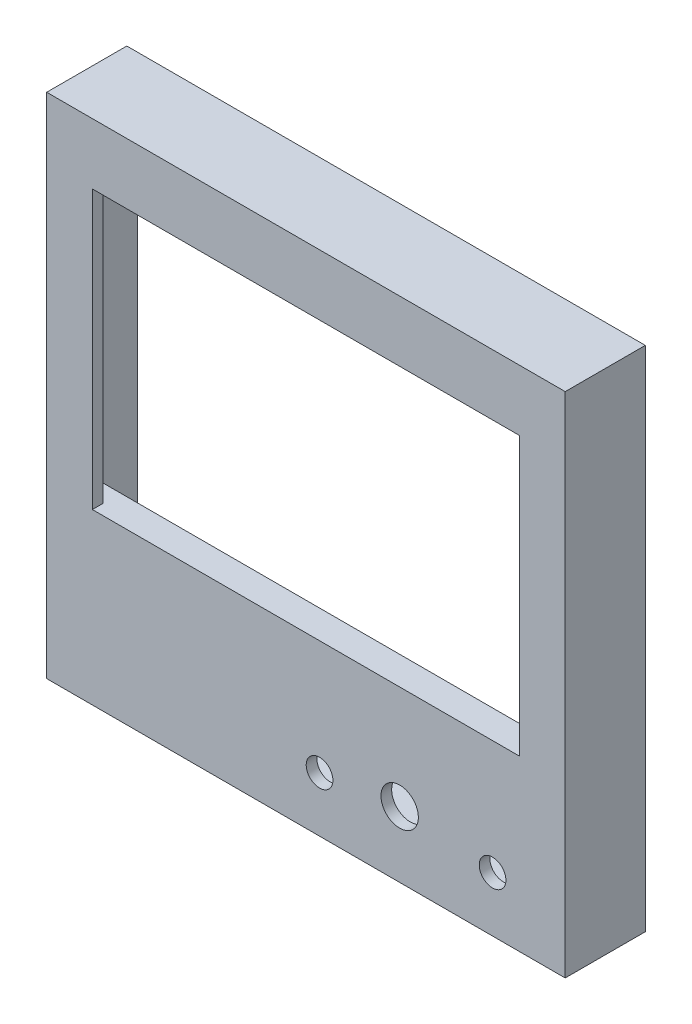
ISO-10303-21;
HEADER;
FILE_DESCRIPTION(('STEP AP214'),'2;1');
FILE_NAME('part.step','',(''),(''),'','','');
FILE_SCHEMA(('AUTOMOTIVE_DESIGN { 1 0 10303 214 1 1 1 1 }'));
ENDSEC;
DATA;
#1=APPLICATION_CONTEXT('core data for automotive mechanical design processes');
#2=APPLICATION_PROTOCOL_DEFINITION('international standard','automotive_design',2000,#1);
#3=PRODUCT_CONTEXT('',#1,'mechanical');
#4=PRODUCT('Part','Part','',(#3));
#5=PRODUCT_RELATED_PRODUCT_CATEGORY('part','',(#4));
#6=PRODUCT_DEFINITION_FORMATION('','',#4);
#7=PRODUCT_DEFINITION_CONTEXT('part definition',#1,'design');
#8=PRODUCT_DEFINITION('design','',#6,#7);
#9=PRODUCT_DEFINITION_SHAPE('','',#8);
#10=(LENGTH_UNIT() NAMED_UNIT(*) SI_UNIT(.MILLI.,.METRE.));
#11=(NAMED_UNIT(*) PLANE_ANGLE_UNIT() SI_UNIT($,.RADIAN.));
#12=(NAMED_UNIT(*) SI_UNIT($,.STERADIAN.) SOLID_ANGLE_UNIT());
#13=UNCERTAINTY_MEASURE_WITH_UNIT(LENGTH_MEASURE(1.E-05),#10,'distance_accuracy_value','');
#14=(GEOMETRIC_REPRESENTATION_CONTEXT(3) GLOBAL_UNCERTAINTY_ASSIGNED_CONTEXT((#13)) GLOBAL_UNIT_ASSIGNED_CONTEXT((#10,
#11,#12)) REPRESENTATION_CONTEXT('',''));
#15=CARTESIAN_POINT('',(0.,0.,0.));
#16=DIRECTION('',(0.,0.,1.));
#17=DIRECTION('',(1.,0.,0.));
#18=AXIS2_PLACEMENT_3D('',#15,#16,#17);
#19=CARTESIAN_POINT('',(0.,0.,0.));
#20=DIRECTION('',(0.,0.,-1.));
#21=DIRECTION('',(-1.,0.,0.));
#22=AXIS2_PLACEMENT_3D('',#19,#20,#21);
#23=PLANE('',#22);
#24=DIRECTION('',(1.,0.,0.));
#25=VECTOR('',#24,1.);
#26=CARTESIAN_POINT('',(46.55,-26.,0.));
#27=LINE('',#26,#25);
#28=CARTESIAN_POINT('',(-46.55,-26.,0.));
#29=VERTEX_POINT('',#28);
#30=CARTESIAN_POINT('',(-40.,-26.,0.));
#31=VERTEX_POINT('',#30);
#32=EDGE_CURVE('E44',#29,#31,#27,.T.);
#33=ORIENTED_EDGE('',*,*,#32,.F.);
#34=DIRECTION('',(0.,-1.,0.));
#35=VECTOR('',#34,1.);
#36=CARTESIAN_POINT('',(-46.55,-35.4,0.));
#37=LINE('',#36,#35);
#38=CARTESIAN_POINT('',(-46.55,35.4,0.));
#39=VERTEX_POINT('',#38);
#40=EDGE_CURVE('E270',#39,#29,#37,.T.);
#41=ORIENTED_EDGE('',*,*,#40,.F.);
#42=DIRECTION('',(-1.,0.,0.));
#43=VECTOR('',#42,1.);
#44=CARTESIAN_POINT('',(-46.55,35.4,0.));
#45=LINE('',#44,#43);
#46=CARTESIAN_POINT('',(46.55,35.4,0.));
#47=VERTEX_POINT('',#46);
#48=EDGE_CURVE('E267',#47,#39,#45,.T.);
#49=ORIENTED_EDGE('',*,*,#48,.F.);
#50=DIRECTION('',(0.,1.,0.));
#51=VECTOR('',#50,1.);
#52=CARTESIAN_POINT('',(46.55,-55.7,0.));
#53=LINE('',#52,#51);
#54=CARTESIAN_POINT('',(46.55,-26.,0.));
#55=VERTEX_POINT('',#54);
#56=EDGE_CURVE('E274',#55,#47,#53,.T.);
#57=ORIENTED_EDGE('',*,*,#56,.F.);
#58=CARTESIAN_POINT('',(40.,-26.,0.));
#59=VERTEX_POINT('',#58);
#60=EDGE_CURVE('E11',#59,#55,#27,.T.);
#61=ORIENTED_EDGE('',*,*,#60,.F.);
#62=DIRECTION('',(0.,1.,0.));
#63=VECTOR('',#62,1.);
#64=CARTESIAN_POINT('',(40.,-26.,0.));
#65=LINE('',#64,#63);
#66=CARTESIAN_POINT('',(40.,26.,0.));
#67=VERTEX_POINT('',#66);
#68=EDGE_CURVE('E242',#59,#67,#65,.T.);
#69=ORIENTED_EDGE('',*,*,#68,.T.);
#70=DIRECTION('',(-1.,0.,0.));
#71=VECTOR('',#70,1.);
#72=CARTESIAN_POINT('',(-40.,26.,0.));
#73=LINE('',#72,#71);
#74=CARTESIAN_POINT('',(-40.,26.,0.));
#75=VERTEX_POINT('',#74);
#76=EDGE_CURVE('E254',#67,#75,#73,.T.);
#77=ORIENTED_EDGE('',*,*,#76,.T.);
#78=DIRECTION('',(0.,-1.,0.));
#79=VECTOR('',#78,1.);
#80=CARTESIAN_POINT('',(-40.,-26.,0.));
#81=LINE('',#80,#79);
#82=EDGE_CURVE('E246',#75,#31,#81,.T.);
#83=ORIENTED_EDGE('',*,*,#82,.T.);
#84=EDGE_LOOP('',(#33,#41,#49,#57,#61,#69,#77,#83));
#85=FACE_BOUND('',#84,.T.);
#86=ADVANCED_FACE('F33',(#85),#23,.T.);
#87=CARTESIAN_POINT('',(0.,0.,2.));
#88=DIRECTION('',(0.,0.,-1.));
#89=DIRECTION('',(-1.,0.,0.));
#90=AXIS2_PLACEMENT_3D('',#87,#88,#89);
#91=PLANE('',#90);
#92=CARTESIAN_POINT('',(34.95,-47.4,2.));
#93=DIRECTION('',(0.,0.,1.));
#94=DIRECTION('',(1.,0.,0.));
#95=AXIS2_PLACEMENT_3D('',#92,#93,#94);
#96=CIRCLE('',#95,2.5);
#97=CARTESIAN_POINT('',(37.45,-47.4,2.));
#98=VERTEX_POINT('',#97);
#99=EDGE_CURVE('E285',#98,#98,#96,.T.);
#100=ORIENTED_EDGE('',*,*,#99,.F.);
#101=EDGE_LOOP('',(#100));
#102=FACE_BOUND('',#101,.T.);
#103=CARTESIAN_POINT('',(2.55000000000003,-47.4,2.));
#104=DIRECTION('',(0.,0.,1.));
#105=DIRECTION('',(1.,0.,0.));
#106=AXIS2_PLACEMENT_3D('',#103,#104,#105);
#107=CIRCLE('',#106,2.5);
#108=CARTESIAN_POINT('',(5.05000000000003,-47.4,2.));
#109=VERTEX_POINT('',#108);
#110=EDGE_CURVE('E277',#109,#109,#107,.T.);
#111=ORIENTED_EDGE('',*,*,#110,.F.);
#112=EDGE_LOOP('',(#111));
#113=FACE_BOUND('',#112,.T.);
#114=CARTESIAN_POINT('',(17.55,-45.4,2.));
#115=DIRECTION('',(0.,0.,1.));
#116=DIRECTION('',(1.,0.,0.));
#117=AXIS2_PLACEMENT_3D('',#114,#115,#116);
#118=CIRCLE('',#117,3.5);
#119=CARTESIAN_POINT('',(21.05,-45.4,2.));
#120=VERTEX_POINT('',#119);
#121=EDGE_CURVE('E178',#120,#120,#118,.T.);
#122=ORIENTED_EDGE('',*,*,#121,.F.);
#123=EDGE_LOOP('',(#122));
#124=FACE_BOUND('',#123,.T.);
#125=DIRECTION('',(0.,1.,0.));
#126=VECTOR('',#125,1.);
#127=CARTESIAN_POINT('',(40.,-26.,2.));
#128=LINE('',#127,#126);
#129=CARTESIAN_POINT('',(40.,-26.,2.));
#130=VERTEX_POINT('',#129);
#131=CARTESIAN_POINT('',(40.,26.,2.));
#132=VERTEX_POINT('',#131);
#133=EDGE_CURVE('E243',#130,#132,#128,.T.);
#134=ORIENTED_EDGE('',*,*,#133,.F.);
#135=DIRECTION('',(1.,0.,0.));
#136=VECTOR('',#135,1.);
#137=CARTESIAN_POINT('',(-40.,-26.,2.));
#138=LINE('',#137,#136);
#139=CARTESIAN_POINT('',(-40.,-26.,2.));
#140=VERTEX_POINT('',#139);
#141=EDGE_CURVE('E250',#140,#130,#138,.T.);
#142=ORIENTED_EDGE('',*,*,#141,.F.);
#143=DIRECTION('',(0.,-1.,0.));
#144=VECTOR('',#143,1.);
#145=CARTESIAN_POINT('',(-40.,-26.,2.));
#146=LINE('',#145,#144);
#147=CARTESIAN_POINT('',(-40.,26.,2.));
#148=VERTEX_POINT('',#147);
#149=EDGE_CURVE('E248',#148,#140,#146,.T.);
#150=ORIENTED_EDGE('',*,*,#149,.F.);
#151=DIRECTION('',(-1.,0.,0.));
#152=VECTOR('',#151,1.);
#153=CARTESIAN_POINT('',(-40.,26.,2.));
#154=LINE('',#153,#152);
#155=EDGE_CURVE('E245',#132,#148,#154,.T.);
#156=ORIENTED_EDGE('',*,*,#155,.F.);
#157=EDGE_LOOP('',(#134,#142,#150,#156));
#158=FACE_BOUND('',#157,.T.);
#159=DIRECTION('',(0.,-1.,0.));
#160=VECTOR('',#159,1.);
#161=CARTESIAN_POINT('',(48.55,37.4,2.));
#162=LINE('',#161,#160);
#163=CARTESIAN_POINT('',(48.55,37.4,2.));
#164=VERTEX_POINT('',#163);
#165=CARTESIAN_POINT('',(48.55,-57.7,2.));
#166=VERTEX_POINT('',#165);
#167=EDGE_CURVE('E167',#164,#166,#162,.T.);
#168=ORIENTED_EDGE('',*,*,#167,.F.);
#169=DIRECTION('',(1.,0.,0.));
#170=VECTOR('',#169,1.);
#171=CARTESIAN_POINT('',(48.55,37.4,2.));
#172=LINE('',#171,#170);
#173=CARTESIAN_POINT('',(-48.55,37.4,2.));
#174=VERTEX_POINT('',#173);
#175=EDGE_CURVE('E184',#174,#164,#172,.T.);
#176=ORIENTED_EDGE('',*,*,#175,.F.);
#177=DIRECTION('',(0.,1.,0.));
#178=VECTOR('',#177,1.);
#179=CARTESIAN_POINT('',(-48.55,37.4,2.));
#180=LINE('',#179,#178);
#181=CARTESIAN_POINT('',(-48.55,-57.7,2.));
#182=VERTEX_POINT('',#181);
#183=EDGE_CURVE('E170',#182,#174,#180,.T.);
#184=ORIENTED_EDGE('',*,*,#183,.F.);
#185=DIRECTION('',(-1.,0.,0.));
#186=VECTOR('',#185,1.);
#187=CARTESIAN_POINT('',(48.55,-57.7,2.));
#188=LINE('',#187,#186);
#189=EDGE_CURVE('E153',#166,#182,#188,.T.);
#190=ORIENTED_EDGE('',*,*,#189,.F.);
#191=EDGE_LOOP('',(#168,#176,#184,#190));
#192=FACE_BOUND('',#191,.T.);
#193=ADVANCED_FACE('F165',(#102,#113,#124,#158,#192),#91,.F.);
#194=CARTESIAN_POINT('',(34.95,-47.4,0.));
#195=DIRECTION('',(0.,0.,-1.));
#196=DIRECTION('',(-1.,0.,0.));
#197=AXIS2_PLACEMENT_3D('',#194,#195,#196);
#198=CIRCLE('',#197,2.5);
#199=CARTESIAN_POINT('',(32.45,-47.4,0.));
#200=VERTEX_POINT('',#199);
#201=EDGE_CURVE('E37',#200,#200,#198,.T.);
#202=ORIENTED_EDGE('',*,*,#201,.F.);
#203=EDGE_LOOP('',(#202));
#204=FACE_BOUND('',#203,.T.);
#205=CARTESIAN_POINT('',(2.55000000000003,-47.4,0.));
#206=DIRECTION('',(0.,0.,-1.));
#207=DIRECTION('',(-1.,0.,0.));
#208=AXIS2_PLACEMENT_3D('',#205,#206,#207);
#209=CIRCLE('',#208,2.5);
#210=CARTESIAN_POINT('',(0.0500000000000305,-47.4,0.));
#211=VERTEX_POINT('',#210);
#212=EDGE_CURVE('E275',#211,#211,#209,.T.);
#213=ORIENTED_EDGE('',*,*,#212,.F.);
#214=EDGE_LOOP('',(#213));
#215=FACE_BOUND('',#214,.T.);
#216=CARTESIAN_POINT('',(17.55,-45.4,0.));
#217=DIRECTION('',(0.,0.,-1.));
#218=DIRECTION('',(-1.,0.,0.));
#219=AXIS2_PLACEMENT_3D('',#216,#217,#218);
#220=CIRCLE('',#219,3.5);
#221=CARTESIAN_POINT('',(14.05,-45.4,0.));
#222=VERTEX_POINT('',#221);
#223=EDGE_CURVE('E175',#222,#222,#220,.T.);
#224=ORIENTED_EDGE('',*,*,#223,.F.);
#225=EDGE_LOOP('',(#224));
#226=FACE_BOUND('',#225,.T.);
#227=DIRECTION('',(-1.,0.,0.));
#228=VECTOR('',#227,1.);
#229=CARTESIAN_POINT('',(46.55,-35.8,0.));
#230=LINE('',#229,#228);
#231=CARTESIAN_POINT('',(46.55,-35.8,0.));
#232=VERTEX_POINT('',#231);
#233=CARTESIAN_POINT('',(-46.55,-35.8,0.));
#234=VERTEX_POINT('',#233);
#235=EDGE_CURVE('E159',#232,#234,#230,.T.);
#236=ORIENTED_EDGE('',*,*,#235,.F.);
#237=CARTESIAN_POINT('',(46.55,-55.7,0.));
#238=VERTEX_POINT('',#237);
#239=EDGE_CURVE('E42',#238,#232,#53,.T.);
#240=ORIENTED_EDGE('',*,*,#239,.F.);
#241=DIRECTION('',(1.,0.,0.));
#242=VECTOR('',#241,1.);
#243=CARTESIAN_POINT('',(-46.55,-55.7,0.));
#244=LINE('',#243,#242);
#245=CARTESIAN_POINT('',(-46.55,-55.7,0.));
#246=VERTEX_POINT('',#245);
#247=EDGE_CURVE('E272',#246,#238,#244,.T.);
#248=ORIENTED_EDGE('',*,*,#247,.F.);
#249=EDGE_CURVE('E269',#234,#246,#37,.T.);
#250=ORIENTED_EDGE('',*,*,#249,.F.);
#251=EDGE_LOOP('',(#236,#240,#248,#250));
#252=FACE_BOUND('',#251,.T.);
#253=ADVANCED_FACE('F35',(#204,#215,#226,#252),#23,.T.);
#254=CARTESIAN_POINT('',(40.,-26.,2.));
#255=DIRECTION('',(-1.,0.,0.));
#256=DIRECTION('',(0.,0.,1.));
#257=AXIS2_PLACEMENT_3D('',#254,#255,#256);
#258=PLANE('',#257);
#259=ORIENTED_EDGE('',*,*,#68,.F.);
#260=DIRECTION('',(0.,0.,-1.));
#261=VECTOR('',#260,1.);
#262=CARTESIAN_POINT('',(40.,-26.,2.));
#263=LINE('',#262,#261);
#264=EDGE_CURVE('E252',#130,#59,#263,.T.);
#265=ORIENTED_EDGE('',*,*,#264,.F.);
#266=ORIENTED_EDGE('',*,*,#133,.T.);
#267=DIRECTION('',(0.,0.,-1.));
#268=VECTOR('',#267,1.);
#269=CARTESIAN_POINT('',(40.,26.,2.));
#270=LINE('',#269,#268);
#271=EDGE_CURVE('E264',#132,#67,#270,.T.);
#272=ORIENTED_EDGE('',*,*,#271,.T.);
#273=EDGE_LOOP('',(#259,#265,#266,#272));
#274=FACE_BOUND('',#273,.T.);
#275=ADVANCED_FACE('F304',(#274),#258,.T.);
#276=CARTESIAN_POINT('',(-40.,26.,2.));
#277=DIRECTION('',(0.,-1.,0.));
#278=DIRECTION('',(0.,0.,-1.));
#279=AXIS2_PLACEMENT_3D('',#276,#277,#278);
#280=PLANE('',#279);
#281=ORIENTED_EDGE('',*,*,#76,.F.);
#282=ORIENTED_EDGE('',*,*,#271,.F.);
#283=ORIENTED_EDGE('',*,*,#155,.T.);
#284=DIRECTION('',(0.,0.,-1.));
#285=VECTOR('',#284,1.);
#286=CARTESIAN_POINT('',(-40.,26.,2.));
#287=LINE('',#286,#285);
#288=EDGE_CURVE('E262',#148,#75,#287,.T.);
#289=ORIENTED_EDGE('',*,*,#288,.T.);
#290=EDGE_LOOP('',(#281,#282,#283,#289));
#291=FACE_BOUND('',#290,.T.);
#292=ADVANCED_FACE('F306',(#291),#280,.T.);
#293=CARTESIAN_POINT('',(-40.,-26.,2.));
#294=DIRECTION('',(1.,0.,0.));
#295=DIRECTION('',(0.,0.,-1.));
#296=AXIS2_PLACEMENT_3D('',#293,#294,#295);
#297=PLANE('',#296);
#298=ORIENTED_EDGE('',*,*,#82,.F.);
#299=ORIENTED_EDGE('',*,*,#288,.F.);
#300=ORIENTED_EDGE('',*,*,#149,.T.);
#301=DIRECTION('',(0.,0.,-1.));
#302=VECTOR('',#301,1.);
#303=CARTESIAN_POINT('',(-40.,-26.,2.));
#304=LINE('',#303,#302);
#305=EDGE_CURVE('E51',#140,#31,#304,.T.);
#306=ORIENTED_EDGE('',*,*,#305,.T.);
#307=EDGE_LOOP('',(#298,#299,#300,#306));
#308=FACE_BOUND('',#307,.T.);
#309=ADVANCED_FACE('F454',(#308),#297,.T.);
#310=CARTESIAN_POINT('',(-40.,-26.,2.));
#311=DIRECTION('',(0.,1.,0.));
#312=DIRECTION('',(0.,0.,1.));
#313=AXIS2_PLACEMENT_3D('',#310,#311,#312);
#314=PLANE('',#313);
#315=ORIENTED_EDGE('',*,*,#264,.T.);
#316=ORIENTED_EDGE('',*,*,#60,.T.);
#317=DIRECTION('',(0.,0.,1.));
#318=VECTOR('',#317,1.);
#319=CARTESIAN_POINT('',(46.55,-26.,-3.3));
#320=LINE('',#319,#318);
#321=CARTESIAN_POINT('',(46.55,-26.,-3.3));
#322=VERTEX_POINT('',#321);
#323=EDGE_CURVE('E230',#322,#55,#320,.T.);
#324=ORIENTED_EDGE('',*,*,#323,.F.);
#325=DIRECTION('',(1.,0.,0.));
#326=VECTOR('',#325,1.);
#327=CARTESIAN_POINT('',(46.55,-26.,-3.3));
#328=LINE('',#327,#326);
#329=CARTESIAN_POINT('',(-46.55,-26.,-3.3));
#330=VERTEX_POINT('',#329);
#331=EDGE_CURVE('E227',#330,#322,#328,.T.);
#332=ORIENTED_EDGE('',*,*,#331,.F.);
#333=DIRECTION('',(0.,0.,1.));
#334=VECTOR('',#333,1.);
#335=CARTESIAN_POINT('',(-46.55,-26.,-3.3));
#336=LINE('',#335,#334);
#337=EDGE_CURVE('E234',#330,#29,#336,.T.);
#338=ORIENTED_EDGE('',*,*,#337,.T.);
#339=ORIENTED_EDGE('',*,*,#32,.T.);
#340=ORIENTED_EDGE('',*,*,#305,.F.);
#341=ORIENTED_EDGE('',*,*,#141,.T.);
#342=EDGE_LOOP('',(#315,#316,#324,#332,#338,#339,#340,#341));
#343=FACE_BOUND('',#342,.T.);
#344=ADVANCED_FACE('F310',(#343),#314,.T.);
#345=CARTESIAN_POINT('',(46.55,-35.8,-3.3));
#346=DIRECTION('',(0.,1.,0.));
#347=DIRECTION('',(0.,0.,1.));
#348=AXIS2_PLACEMENT_3D('',#345,#346,#347);
#349=PLANE('',#348);
#350=ORIENTED_EDGE('',*,*,#235,.T.);
#351=DIRECTION('',(0.,0.,1.));
#352=VECTOR('',#351,1.);
#353=CARTESIAN_POINT('',(-46.55,-35.8,-3.3));
#354=LINE('',#353,#352);
#355=CARTESIAN_POINT('',(-46.55,-35.8,-3.3));
#356=VERTEX_POINT('',#355);
#357=EDGE_CURVE('E237',#356,#234,#354,.T.);
#358=ORIENTED_EDGE('',*,*,#357,.F.);
#359=DIRECTION('',(-1.,0.,0.));
#360=VECTOR('',#359,1.);
#361=CARTESIAN_POINT('',(46.55,-35.8,-3.3));
#362=LINE('',#361,#360);
#363=CARTESIAN_POINT('',(46.55,-35.8,-3.3));
#364=VERTEX_POINT('',#363);
#365=EDGE_CURVE('E221',#364,#356,#362,.T.);
#366=ORIENTED_EDGE('',*,*,#365,.F.);
#367=DIRECTION('',(0.,0.,1.));
#368=VECTOR('',#367,1.);
#369=CARTESIAN_POINT('',(46.55,-35.8,-3.3));
#370=LINE('',#369,#368);
#371=EDGE_CURVE('E239',#364,#232,#370,.T.);
#372=ORIENTED_EDGE('',*,*,#371,.T.);
#373=EDGE_LOOP('',(#350,#358,#366,#372));
#374=FACE_BOUND('',#373,.T.);
#375=ADVANCED_FACE('F340',(#374),#349,.F.);
#376=CARTESIAN_POINT('',(0.,0.,-3.3));
#377=DIRECTION('',(0.,0.,-1.));
#378=DIRECTION('',(-1.,0.,0.));
#379=AXIS2_PLACEMENT_3D('',#376,#377,#378);
#380=PLANE('',#379);
#381=DIRECTION('',(0.,-1.,0.));
#382=VECTOR('',#381,1.);
#383=CARTESIAN_POINT('',(46.55,-26.,-3.3));
#384=LINE('',#383,#382);
#385=EDGE_CURVE('E218',#322,#364,#384,.T.);
#386=ORIENTED_EDGE('',*,*,#385,.T.);
#387=ORIENTED_EDGE('',*,*,#365,.T.);
#388=DIRECTION('',(0.,1.,0.));
#389=VECTOR('',#388,1.);
#390=CARTESIAN_POINT('',(-46.55,-26.,-3.3));
#391=LINE('',#390,#389);
#392=EDGE_CURVE('E224',#356,#330,#391,.T.);
#393=ORIENTED_EDGE('',*,*,#392,.T.);
#394=ORIENTED_EDGE('',*,*,#331,.T.);
#395=EDGE_LOOP('',(#386,#387,#393,#394));
#396=FACE_BOUND('',#395,.T.);
#397=ADVANCED_FACE('F342',(#396),#380,.T.);
#398=CARTESIAN_POINT('',(0.,0.,-13.));
#399=DIRECTION('',(0.,0.,-1.));
#400=DIRECTION('',(-1.,0.,0.));
#401=AXIS2_PLACEMENT_3D('',#398,#399,#400);
#402=PLANE('',#401);
#403=DIRECTION('',(0.,-1.,0.));
#404=VECTOR('',#403,1.);
#405=CARTESIAN_POINT('',(48.55,37.4,-13.));
#406=LINE('',#405,#404);
#407=CARTESIAN_POINT('',(48.55,37.4,-13.));
#408=VERTEX_POINT('',#407);
#409=CARTESIAN_POINT('',(48.55,-57.7,-13.));
#410=VERTEX_POINT('',#409);
#411=EDGE_CURVE('E207',#408,#410,#406,.T.);
#412=ORIENTED_EDGE('',*,*,#411,.T.);
#413=DIRECTION('',(-1.,0.,0.));
#414=VECTOR('',#413,1.);
#415=CARTESIAN_POINT('',(48.55,-57.7,-13.));
#416=LINE('',#415,#414);
#417=CARTESIAN_POINT('',(-48.55,-57.7,-13.));
#418=VERTEX_POINT('',#417);
#419=EDGE_CURVE('E154',#410,#418,#416,.T.);
#420=ORIENTED_EDGE('',*,*,#419,.T.);
#421=DIRECTION('',(0.,1.,0.));
#422=VECTOR('',#421,1.);
#423=CARTESIAN_POINT('',(-48.55,37.4,-13.));
#424=LINE('',#423,#422);
#425=CARTESIAN_POINT('',(-48.55,37.4,-13.));
#426=VERTEX_POINT('',#425);
#427=EDGE_CURVE('E210',#418,#426,#424,.T.);
#428=ORIENTED_EDGE('',*,*,#427,.T.);
#429=DIRECTION('',(1.,0.,0.));
#430=VECTOR('',#429,1.);
#431=CARTESIAN_POINT('',(48.55,37.4,-13.));
#432=LINE('',#431,#430);
#433=EDGE_CURVE('E212',#426,#408,#432,.T.);
#434=ORIENTED_EDGE('',*,*,#433,.T.);
#435=EDGE_LOOP('',(#412,#420,#428,#434));
#436=FACE_BOUND('',#435,.T.);
#437=DIRECTION('',(-1.,0.,0.));
#438=VECTOR('',#437,1.);
#439=CARTESIAN_POINT('',(46.55,-55.7,-13.));
#440=LINE('',#439,#438);
#441=CARTESIAN_POINT('',(46.55,-55.7,-13.));
#442=VERTEX_POINT('',#441);
#443=CARTESIAN_POINT('',(-46.55,-55.7,-13.));
#444=VERTEX_POINT('',#443);
#445=EDGE_CURVE('E188',#442,#444,#440,.T.);
#446=ORIENTED_EDGE('',*,*,#445,.F.);
#447=DIRECTION('',(0.,-1.,0.));
#448=VECTOR('',#447,1.);
#449=CARTESIAN_POINT('',(46.55,35.4,-13.));
#450=LINE('',#449,#448);
#451=CARTESIAN_POINT('',(46.55,35.4,-13.));
#452=VERTEX_POINT('',#451);
#453=EDGE_CURVE('E186',#452,#442,#450,.T.);
#454=ORIENTED_EDGE('',*,*,#453,.F.);
#455=DIRECTION('',(1.,0.,0.));
#456=VECTOR('',#455,1.);
#457=CARTESIAN_POINT('',(46.55,35.4,-13.));
#458=LINE('',#457,#456);
#459=CARTESIAN_POINT('',(-46.55,35.4,-13.));
#460=VERTEX_POINT('',#459);
#461=EDGE_CURVE('E193',#460,#452,#458,.T.);
#462=ORIENTED_EDGE('',*,*,#461,.F.);
#463=DIRECTION('',(0.,1.,0.));
#464=VECTOR('',#463,1.);
#465=CARTESIAN_POINT('',(-46.55,35.4,-13.));
#466=LINE('',#465,#464);
#467=EDGE_CURVE('E190',#444,#460,#466,.T.);
#468=ORIENTED_EDGE('',*,*,#467,.F.);
#469=EDGE_LOOP('',(#446,#454,#462,#468));
#470=FACE_BOUND('',#469,.T.);
#471=ADVANCED_FACE('F328',(#436,#470),#402,.T.);
#472=CARTESIAN_POINT('',(48.55,37.4,-13.));
#473=DIRECTION('',(-1.,0.,0.));
#474=DIRECTION('',(0.,-1.,0.));
#475=AXIS2_PLACEMENT_3D('',#472,#473,#474);
#476=PLANE('',#475);
#477=DIRECTION('',(0.,0.,1.));
#478=VECTOR('',#477,1.);
#479=CARTESIAN_POINT('',(48.55,37.4,-13.));
#480=LINE('',#479,#478);
#481=EDGE_CURVE('E174',#408,#164,#480,.T.);
#482=ORIENTED_EDGE('',*,*,#481,.T.);
#483=ORIENTED_EDGE('',*,*,#167,.T.);
#484=DIRECTION('',(0.,0.,1.));
#485=VECTOR('',#484,1.);
#486=CARTESIAN_POINT('',(48.55,-57.7,-13.));
#487=LINE('',#486,#485);
#488=EDGE_CURVE('E149',#410,#166,#487,.T.);
#489=ORIENTED_EDGE('',*,*,#488,.F.);
#490=ORIENTED_EDGE('',*,*,#411,.F.);
#491=EDGE_LOOP('',(#482,#483,#489,#490));
#492=FACE_BOUND('',#491,.T.);
#493=ADVANCED_FACE('F172',(#492),#476,.F.);
#494=CARTESIAN_POINT('',(48.55,-57.7,-13.));
#495=DIRECTION('',(0.,1.,0.));
#496=DIRECTION('',(0.,0.,1.));
#497=AXIS2_PLACEMENT_3D('',#494,#495,#496);
#498=PLANE('',#497);
#499=ORIENTED_EDGE('',*,*,#488,.T.);
#500=ORIENTED_EDGE('',*,*,#189,.T.);
#501=DIRECTION('',(0.,0.,1.));
#502=VECTOR('',#501,1.);
#503=CARTESIAN_POINT('',(-48.55,-57.7,-13.));
#504=LINE('',#503,#502);
#505=EDGE_CURVE('E160',#418,#182,#504,.T.);
#506=ORIENTED_EDGE('',*,*,#505,.F.);
#507=ORIENTED_EDGE('',*,*,#419,.F.);
#508=EDGE_LOOP('',(#499,#500,#506,#507));
#509=FACE_BOUND('',#508,.T.);
#510=ADVANCED_FACE('F151',(#509),#498,.F.);
#511=CARTESIAN_POINT('',(-48.55,37.4,-13.));
#512=DIRECTION('',(1.,0.,0.));
#513=DIRECTION('',(0.,1.,0.));
#514=AXIS2_PLACEMENT_3D('',#511,#512,#513);
#515=PLANE('',#514);
#516=ORIENTED_EDGE('',*,*,#505,.T.);
#517=ORIENTED_EDGE('',*,*,#183,.T.);
#518=DIRECTION('',(0.,0.,1.));
#519=VECTOR('',#518,1.);
#520=CARTESIAN_POINT('',(-48.55,37.4,-13.));
#521=LINE('',#520,#519);
#522=EDGE_CURVE('E215',#426,#174,#521,.T.);
#523=ORIENTED_EDGE('',*,*,#522,.F.);
#524=ORIENTED_EDGE('',*,*,#427,.F.);
#525=EDGE_LOOP('',(#516,#517,#523,#524));
#526=FACE_BOUND('',#525,.T.);
#527=ADVANCED_FACE('F393',(#526),#515,.F.);
#528=CARTESIAN_POINT('',(48.55,37.4,-13.));
#529=DIRECTION('',(0.,-1.,0.));
#530=DIRECTION('',(0.,0.,-1.));
#531=AXIS2_PLACEMENT_3D('',#528,#529,#530);
#532=PLANE('',#531);
#533=ORIENTED_EDGE('',*,*,#522,.T.);
#534=ORIENTED_EDGE('',*,*,#175,.T.);
#535=ORIENTED_EDGE('',*,*,#481,.F.);
#536=ORIENTED_EDGE('',*,*,#433,.F.);
#537=EDGE_LOOP('',(#533,#534,#535,#536));
#538=FACE_BOUND('',#537,.T.);
#539=ADVANCED_FACE('F389',(#538),#532,.F.);
#540=CARTESIAN_POINT('',(46.55,35.4,-13.));
#541=DIRECTION('',(-1.,0.,0.));
#542=DIRECTION('',(0.,0.,1.));
#543=AXIS2_PLACEMENT_3D('',#540,#541,#542);
#544=PLANE('',#543);
#545=ORIENTED_EDGE('',*,*,#323,.T.);
#546=ORIENTED_EDGE('',*,*,#56,.T.);
#547=DIRECTION('',(0.,0.,1.));
#548=VECTOR('',#547,1.);
#549=CARTESIAN_POINT('',(46.55,35.4,-13.));
#550=LINE('',#549,#548);
#551=EDGE_CURVE('E195',#452,#47,#550,.T.);
#552=ORIENTED_EDGE('',*,*,#551,.F.);
#553=ORIENTED_EDGE('',*,*,#453,.T.);
#554=DIRECTION('',(0.,0.,1.));
#555=VECTOR('',#554,1.);
#556=CARTESIAN_POINT('',(46.55,-55.7,-13.));
#557=LINE('',#556,#555);
#558=EDGE_CURVE('E204',#442,#238,#557,.T.);
#559=ORIENTED_EDGE('',*,*,#558,.T.);
#560=ORIENTED_EDGE('',*,*,#239,.T.);
#561=ORIENTED_EDGE('',*,*,#371,.F.);
#562=ORIENTED_EDGE('',*,*,#385,.F.);
#563=EDGE_LOOP('',(#545,#546,#552,#553,#559,#560,#561,#562));
#564=FACE_BOUND('',#563,.T.);
#565=ADVANCED_FACE('F314',(#564),#544,.T.);
#566=CARTESIAN_POINT('',(46.55,-55.7,-13.));
#567=DIRECTION('',(0.,1.,0.));
#568=DIRECTION('',(0.,0.,1.));
#569=AXIS2_PLACEMENT_3D('',#566,#567,#568);
#570=PLANE('',#569);
#571=DIRECTION('',(0.,0.,1.));
#572=VECTOR('',#571,1.);
#573=CARTESIAN_POINT('',(-46.55,-55.7,-13.));
#574=LINE('',#573,#572);
#575=EDGE_CURVE('E201',#444,#246,#574,.T.);
#576=ORIENTED_EDGE('',*,*,#575,.T.);
#577=ORIENTED_EDGE('',*,*,#247,.T.);
#578=ORIENTED_EDGE('',*,*,#558,.F.);
#579=ORIENTED_EDGE('',*,*,#445,.T.);
#580=EDGE_LOOP('',(#576,#577,#578,#579));
#581=FACE_BOUND('',#580,.T.);
#582=ADVANCED_FACE('F332',(#581),#570,.T.);
#583=CARTESIAN_POINT('',(-46.55,35.4,-13.));
#584=DIRECTION('',(1.,0.,0.));
#585=DIRECTION('',(0.,0.,-1.));
#586=AXIS2_PLACEMENT_3D('',#583,#584,#585);
#587=PLANE('',#586);
#588=DIRECTION('',(0.,0.,1.));
#589=VECTOR('',#588,1.);
#590=CARTESIAN_POINT('',(-46.55,35.4,-13.));
#591=LINE('',#590,#589);
#592=EDGE_CURVE('E198',#460,#39,#591,.T.);
#593=ORIENTED_EDGE('',*,*,#592,.T.);
#594=ORIENTED_EDGE('',*,*,#40,.T.);
#595=ORIENTED_EDGE('',*,*,#337,.F.);
#596=ORIENTED_EDGE('',*,*,#392,.F.);
#597=ORIENTED_EDGE('',*,*,#357,.T.);
#598=ORIENTED_EDGE('',*,*,#249,.T.);
#599=ORIENTED_EDGE('',*,*,#575,.F.);
#600=ORIENTED_EDGE('',*,*,#467,.T.);
#601=EDGE_LOOP('',(#593,#594,#595,#596,#597,#598,#599,#600));
#602=FACE_BOUND('',#601,.T.);
#603=ADVANCED_FACE('F321',(#602),#587,.T.);
#604=CARTESIAN_POINT('',(46.55,35.4,-13.));
#605=DIRECTION('',(0.,-1.,0.));
#606=DIRECTION('',(0.,0.,-1.));
#607=AXIS2_PLACEMENT_3D('',#604,#605,#606);
#608=PLANE('',#607);
#609=ORIENTED_EDGE('',*,*,#551,.T.);
#610=ORIENTED_EDGE('',*,*,#48,.T.);
#611=ORIENTED_EDGE('',*,*,#592,.F.);
#612=ORIENTED_EDGE('',*,*,#461,.T.);
#613=EDGE_LOOP('',(#609,#610,#611,#612));
#614=FACE_BOUND('',#613,.T.);
#615=ADVANCED_FACE('F319',(#614),#608,.T.);
#616=CARTESIAN_POINT('',(17.55,-45.4,-27.));
#617=DIRECTION('',(0.,0.,1.));
#618=DIRECTION('',(1.,0.,0.));
#619=AXIS2_PLACEMENT_3D('',#616,#617,#618);
#620=CYLINDRICAL_SURFACE('',#619,3.5);
#621=ORIENTED_EDGE('',*,*,#223,.T.);
#622=EDGE_LOOP('',(#621));
#623=FACE_BOUND('',#622,.T.);
#624=ORIENTED_EDGE('',*,*,#121,.T.);
#625=EDGE_LOOP('',(#624));
#626=FACE_BOUND('',#625,.T.);
#627=ADVANCED_FACE('F371',(#623,#626),#620,.F.);
#628=CARTESIAN_POINT('',(2.55000000000003,-47.4,-27.));
#629=DIRECTION('',(0.,0.,1.));
#630=DIRECTION('',(1.,0.,0.));
#631=AXIS2_PLACEMENT_3D('',#628,#629,#630);
#632=CYLINDRICAL_SURFACE('',#631,2.5);
#633=ORIENTED_EDGE('',*,*,#212,.T.);
#634=EDGE_LOOP('',(#633));
#635=FACE_BOUND('',#634,.T.);
#636=ORIENTED_EDGE('',*,*,#110,.T.);
#637=EDGE_LOOP('',(#636));
#638=FACE_BOUND('',#637,.T.);
#639=ADVANCED_FACE('F374',(#635,#638),#632,.F.);
#640=CARTESIAN_POINT('',(34.95,-47.4,-27.));
#641=DIRECTION('',(0.,0.,1.));
#642=DIRECTION('',(1.,0.,0.));
#643=AXIS2_PLACEMENT_3D('',#640,#641,#642);
#644=CYLINDRICAL_SURFACE('',#643,2.5);
#645=ORIENTED_EDGE('',*,*,#201,.T.);
#646=EDGE_LOOP('',(#645));
#647=FACE_BOUND('',#646,.T.);
#648=ORIENTED_EDGE('',*,*,#99,.T.);
#649=EDGE_LOOP('',(#648));
#650=FACE_BOUND('',#649,.T.);
#651=ADVANCED_FACE('F290',(#647,#650),#644,.F.);
#652=CLOSED_SHELL('',(#86,#193,#253,#275,#292,#309,#344,#375,#397,#471,#493,#510,#527,#539,#565,
#582,#603,#615,#627,#639,#651));
#653=MANIFOLD_SOLID_BREP('B2',#652);
#654=ADVANCED_BREP_SHAPE_REPRESENTATION('',(#18,#653),#14);
#655=SHAPE_DEFINITION_REPRESENTATION(#9,#654);
ENDSEC;
END-ISO-10303-21;
